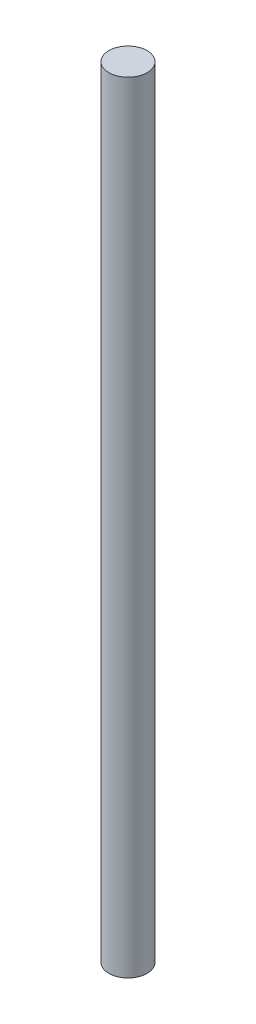
ISO-10303-21;
HEADER;
FILE_DESCRIPTION(('STEP AP214'),'2;1');
FILE_NAME('part.step','',(''),(''),'','','');
FILE_SCHEMA(('AUTOMOTIVE_DESIGN { 1 0 10303 214 1 1 1 1 }'));
ENDSEC;
DATA;
#1=APPLICATION_CONTEXT('core data for automotive mechanical design processes');
#2=APPLICATION_PROTOCOL_DEFINITION('international standard','automotive_design',2000,#1);
#3=PRODUCT_CONTEXT('',#1,'mechanical');
#4=PRODUCT('Part','Part','',(#3));
#5=PRODUCT_RELATED_PRODUCT_CATEGORY('part','',(#4));
#6=PRODUCT_DEFINITION_FORMATION('','',#4);
#7=PRODUCT_DEFINITION_CONTEXT('part definition',#1,'design');
#8=PRODUCT_DEFINITION('design','',#6,#7);
#9=PRODUCT_DEFINITION_SHAPE('','',#8);
#10=(LENGTH_UNIT() NAMED_UNIT(*) SI_UNIT(.MILLI.,.METRE.));
#11=(NAMED_UNIT(*) PLANE_ANGLE_UNIT() SI_UNIT($,.RADIAN.));
#12=(NAMED_UNIT(*) SI_UNIT($,.STERADIAN.) SOLID_ANGLE_UNIT());
#13=UNCERTAINTY_MEASURE_WITH_UNIT(LENGTH_MEASURE(1.E-05),#10,'distance_accuracy_value','');
#14=(GEOMETRIC_REPRESENTATION_CONTEXT(3) GLOBAL_UNCERTAINTY_ASSIGNED_CONTEXT((#13)) GLOBAL_UNIT_ASSIGNED_CONTEXT((#10,
#11,#12)) REPRESENTATION_CONTEXT('',''));
#15=CARTESIAN_POINT('',(0.,0.,0.));
#16=DIRECTION('',(0.,0.,1.));
#17=DIRECTION('',(1.,0.,0.));
#18=AXIS2_PLACEMENT_3D('',#15,#16,#17);
#19=CARTESIAN_POINT('',(0.,61.2,0.));
#20=DIRECTION('',(0.,-1.,0.));
#21=DIRECTION('',(0.,0.,-1.));
#22=AXIS2_PLACEMENT_3D('',#19,#20,#21);
#23=CYLINDRICAL_SURFACE('',#22,1.5);
#24=CARTESIAN_POINT('',(0.,61.2,0.));
#25=DIRECTION('',(0.,1.,0.));
#26=DIRECTION('',(0.,0.,1.));
#27=AXIS2_PLACEMENT_3D('',#24,#25,#26);
#28=CIRCLE('',#27,1.5);
#29=CARTESIAN_POINT('',(0.,61.2,1.5));
#30=VERTEX_POINT('',#29);
#31=EDGE_CURVE('E10',#30,#30,#28,.T.);
#32=ORIENTED_EDGE('',*,*,#31,.F.);
#33=EDGE_LOOP('',(#32));
#34=FACE_BOUND('',#33,.T.);
#35=CARTESIAN_POINT('',(0.,0.,0.));
#36=DIRECTION('',(0.,1.,0.));
#37=DIRECTION('',(0.,0.,1.));
#38=AXIS2_PLACEMENT_3D('',#35,#36,#37);
#39=CIRCLE('',#38,1.5);
#40=CARTESIAN_POINT('',(0.,0.,1.5));
#41=VERTEX_POINT('',#40);
#42=EDGE_CURVE('E34',#41,#41,#39,.T.);
#43=ORIENTED_EDGE('',*,*,#42,.T.);
#44=EDGE_LOOP('',(#43));
#45=FACE_BOUND('',#44,.T.);
#46=ADVANCED_FACE('F31',(#34,#45),#23,.T.);
#47=CARTESIAN_POINT('',(0.,61.2,0.));
#48=DIRECTION('',(0.,1.,0.));
#49=DIRECTION('',(0.,0.,1.));
#50=AXIS2_PLACEMENT_3D('',#47,#48,#49);
#51=PLANE('',#50);
#52=ORIENTED_EDGE('',*,*,#31,.T.);
#53=EDGE_LOOP('',(#52));
#54=FACE_BOUND('',#53,.T.);
#55=ADVANCED_FACE('F46',(#54),#51,.T.);
#56=CARTESIAN_POINT('',(0.,0.,0.));
#57=DIRECTION('',(0.,1.,0.));
#58=DIRECTION('',(0.,0.,1.));
#59=AXIS2_PLACEMENT_3D('',#56,#57,#58);
#60=PLANE('',#59);
#61=ORIENTED_EDGE('',*,*,#42,.F.);
#62=EDGE_LOOP('',(#61));
#63=FACE_BOUND('',#62,.T.);
#64=ADVANCED_FACE('F44',(#63),#60,.F.);
#65=CLOSED_SHELL('',(#46,#55,#64));
#66=MANIFOLD_SOLID_BREP('B2',#65);
#67=ADVANCED_BREP_SHAPE_REPRESENTATION('',(#18,#66),#14);
#68=SHAPE_DEFINITION_REPRESENTATION(#9,#67);
ENDSEC;
END-ISO-10303-21;
